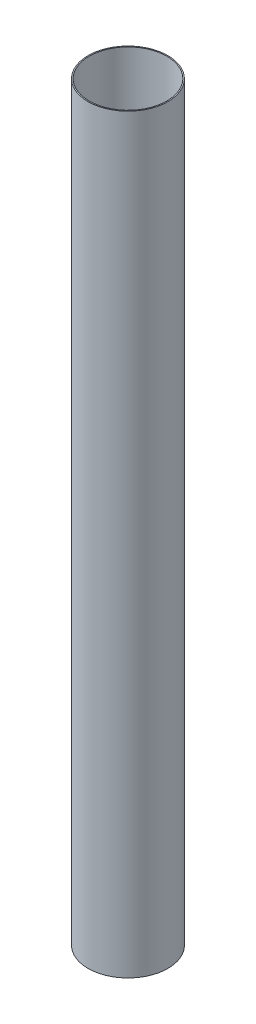
ISO-10303-21;
HEADER;
FILE_DESCRIPTION(('STEP AP214'),'2;1');
FILE_NAME('part.step','',(''),(''),'','','');
FILE_SCHEMA(('AUTOMOTIVE_DESIGN { 1 0 10303 214 1 1 1 1 }'));
ENDSEC;
DATA;
#1=APPLICATION_CONTEXT('core data for automotive mechanical design processes');
#2=APPLICATION_PROTOCOL_DEFINITION('international standard','automotive_design',2000,#1);
#3=PRODUCT_CONTEXT('',#1,'mechanical');
#4=PRODUCT('Part','Part','',(#3));
#5=PRODUCT_RELATED_PRODUCT_CATEGORY('part','',(#4));
#6=PRODUCT_DEFINITION_FORMATION('','',#4);
#7=PRODUCT_DEFINITION_CONTEXT('part definition',#1,'design');
#8=PRODUCT_DEFINITION('design','',#6,#7);
#9=PRODUCT_DEFINITION_SHAPE('','',#8);
#10=(LENGTH_UNIT() NAMED_UNIT(*) SI_UNIT(.MILLI.,.METRE.));
#11=(NAMED_UNIT(*) PLANE_ANGLE_UNIT() SI_UNIT($,.RADIAN.));
#12=(NAMED_UNIT(*) SI_UNIT($,.STERADIAN.) SOLID_ANGLE_UNIT());
#13=UNCERTAINTY_MEASURE_WITH_UNIT(LENGTH_MEASURE(1.E-05),#10,'distance_accuracy_value','');
#14=(GEOMETRIC_REPRESENTATION_CONTEXT(3) GLOBAL_UNCERTAINTY_ASSIGNED_CONTEXT((#13)) GLOBAL_UNIT_ASSIGNED_CONTEXT((#10,
#11,#12)) REPRESENTATION_CONTEXT('',''));
#15=CARTESIAN_POINT('',(0.,0.,0.));
#16=DIRECTION('',(0.,0.,1.));
#17=DIRECTION('',(1.,0.,0.));
#18=AXIS2_PLACEMENT_3D('',#15,#16,#17);
#19=CARTESIAN_POINT('',(0.,1473.2,0.));
#20=DIRECTION('',(0.,1.,0.));
#21=DIRECTION('',(0.,0.,1.));
#22=AXIS2_PLACEMENT_3D('',#19,#20,#21);
#23=PLANE('',#22);
#24=CARTESIAN_POINT('',(0.,1473.2,0.));
#25=DIRECTION('',(0.,1.,0.));
#26=DIRECTION('',(0.,0.,1.));
#27=AXIS2_PLACEMENT_3D('',#24,#25,#26);
#28=CIRCLE('',#27,78.359);
#29=CARTESIAN_POINT('',(0.,1473.2,78.359));
#30=VERTEX_POINT('',#29);
#31=EDGE_CURVE('E10',#30,#30,#28,.T.);
#32=ORIENTED_EDGE('',*,*,#31,.T.);
#33=EDGE_LOOP('',(#32));
#34=FACE_BOUND('',#33,.T.);
#35=CARTESIAN_POINT('',(0.,1473.2,0.));
#36=DIRECTION('',(0.,1.,0.));
#37=DIRECTION('',(0.,0.,1.));
#38=AXIS2_PLACEMENT_3D('',#35,#36,#37);
#39=CIRCLE('',#38,76.2);
#40=CARTESIAN_POINT('',(0.,1473.2,76.2));
#41=VERTEX_POINT('',#40);
#42=EDGE_CURVE('E56',#41,#41,#39,.T.);
#43=ORIENTED_EDGE('',*,*,#42,.F.);
#44=EDGE_LOOP('',(#43));
#45=FACE_BOUND('',#44,.T.);
#46=ADVANCED_FACE('F43',(#34,#45),#23,.T.);
#47=CARTESIAN_POINT('',(0.,0.,0.));
#48=DIRECTION('',(0.,1.,0.));
#49=DIRECTION('',(0.,0.,1.));
#50=AXIS2_PLACEMENT_3D('',#47,#48,#49);
#51=PLANE('',#50);
#52=CARTESIAN_POINT('',(0.,0.,0.));
#53=DIRECTION('',(0.,1.,0.));
#54=DIRECTION('',(0.,0.,1.));
#55=AXIS2_PLACEMENT_3D('',#52,#53,#54);
#56=CIRCLE('',#55,78.359);
#57=CARTESIAN_POINT('',(0.,0.,78.359));
#58=VERTEX_POINT('',#57);
#59=EDGE_CURVE('E47',#58,#58,#56,.T.);
#60=ORIENTED_EDGE('',*,*,#59,.F.);
#61=EDGE_LOOP('',(#60));
#62=FACE_BOUND('',#61,.T.);
#63=CARTESIAN_POINT('',(0.,0.,0.));
#64=DIRECTION('',(0.,1.,0.));
#65=DIRECTION('',(0.,0.,1.));
#66=AXIS2_PLACEMENT_3D('',#63,#64,#65);
#67=CIRCLE('',#66,76.2);
#68=CARTESIAN_POINT('',(0.,0.,76.2));
#69=VERTEX_POINT('',#68);
#70=EDGE_CURVE('E58',#69,#69,#67,.T.);
#71=ORIENTED_EDGE('',*,*,#70,.T.);
#72=EDGE_LOOP('',(#71));
#73=FACE_BOUND('',#72,.T.);
#74=ADVANCED_FACE('F70',(#62,#73),#51,.F.);
#75=CARTESIAN_POINT('',(0.,1473.2,0.));
#76=DIRECTION('',(0.,-1.,0.));
#77=DIRECTION('',(0.,0.,-1.));
#78=AXIS2_PLACEMENT_3D('',#75,#76,#77);
#79=CYLINDRICAL_SURFACE('',#78,78.359);
#80=ORIENTED_EDGE('',*,*,#31,.F.);
#81=EDGE_LOOP('',(#80));
#82=FACE_BOUND('',#81,.T.);
#83=ORIENTED_EDGE('',*,*,#59,.T.);
#84=EDGE_LOOP('',(#83));
#85=FACE_BOUND('',#84,.T.);
#86=ADVANCED_FACE('F45',(#82,#85),#79,.T.);
#87=CARTESIAN_POINT('',(0.,1473.2,0.));
#88=DIRECTION('',(0.,-1.,0.));
#89=DIRECTION('',(0.,0.,-1.));
#90=AXIS2_PLACEMENT_3D('',#87,#88,#89);
#91=CYLINDRICAL_SURFACE('',#90,76.2);
#92=ORIENTED_EDGE('',*,*,#42,.T.);
#93=EDGE_LOOP('',(#92));
#94=FACE_BOUND('',#93,.T.);
#95=ORIENTED_EDGE('',*,*,#70,.F.);
#96=EDGE_LOOP('',(#95));
#97=FACE_BOUND('',#96,.T.);
#98=ADVANCED_FACE('F66',(#94,#97),#91,.F.);
#99=CLOSED_SHELL('',(#46,#74,#86,#98));
#100=MANIFOLD_SOLID_BREP('B2',#99);
#101=ADVANCED_BREP_SHAPE_REPRESENTATION('',(#18,#100),#14);
#102=SHAPE_DEFINITION_REPRESENTATION(#9,#101);
ENDSEC;
END-ISO-10303-21;
